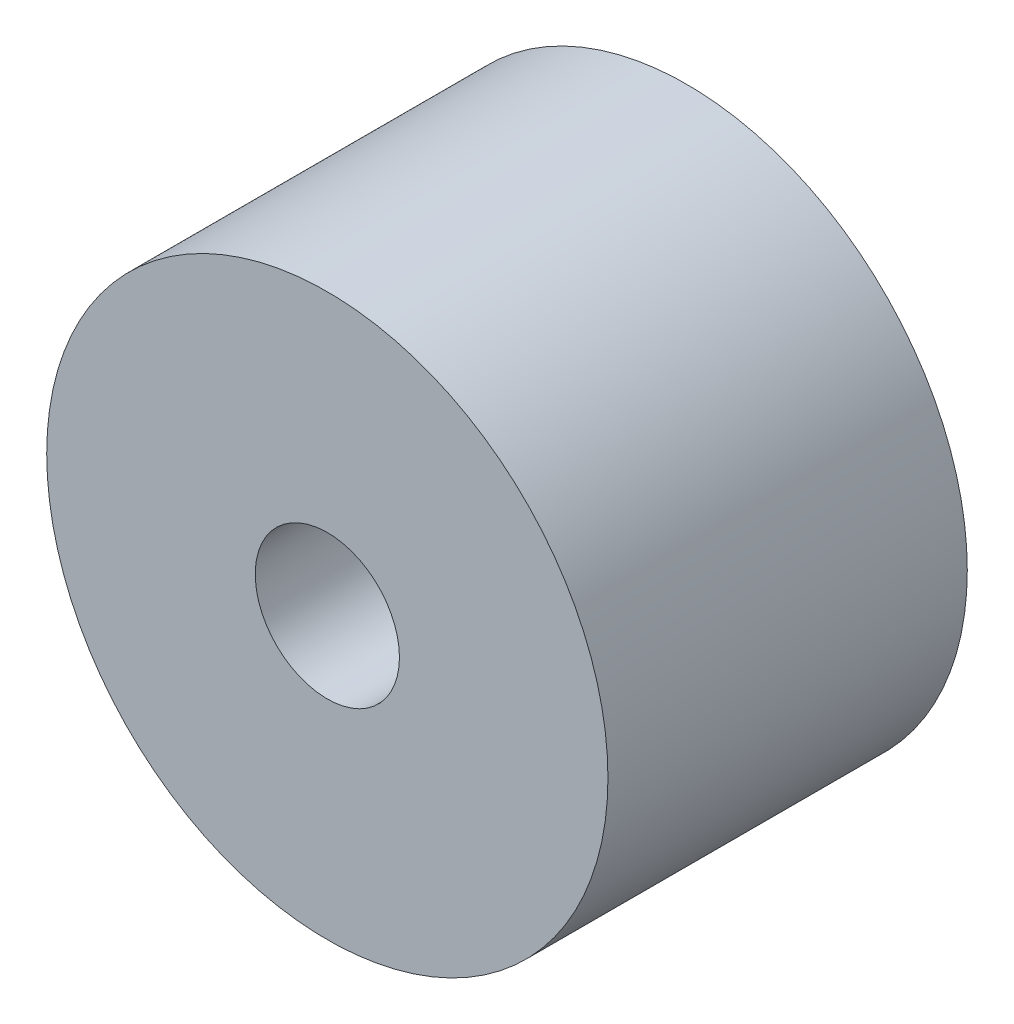
ISO-10303-21;
HEADER;
FILE_DESCRIPTION(('STEP AP214'),'2;1');
FILE_NAME('part.step','',(''),(''),'','','');
FILE_SCHEMA(('AUTOMOTIVE_DESIGN { 1 0 10303 214 1 1 1 1 }'));
ENDSEC;
DATA;
#1=APPLICATION_CONTEXT('core data for automotive mechanical design processes');
#2=APPLICATION_PROTOCOL_DEFINITION('international standard','automotive_design',2000,#1);
#3=PRODUCT_CONTEXT('',#1,'mechanical');
#4=PRODUCT('Part','Part','',(#3));
#5=PRODUCT_RELATED_PRODUCT_CATEGORY('part','',(#4));
#6=PRODUCT_DEFINITION_FORMATION('','',#4);
#7=PRODUCT_DEFINITION_CONTEXT('part definition',#1,'design');
#8=PRODUCT_DEFINITION('design','',#6,#7);
#9=PRODUCT_DEFINITION_SHAPE('','',#8);
#10=(LENGTH_UNIT() NAMED_UNIT(*) SI_UNIT(.MILLI.,.METRE.));
#11=(NAMED_UNIT(*) PLANE_ANGLE_UNIT() SI_UNIT($,.RADIAN.));
#12=(NAMED_UNIT(*) SI_UNIT($,.STERADIAN.) SOLID_ANGLE_UNIT());
#13=UNCERTAINTY_MEASURE_WITH_UNIT(LENGTH_MEASURE(1.E-05),#10,'distance_accuracy_value','');
#14=(GEOMETRIC_REPRESENTATION_CONTEXT(3) GLOBAL_UNCERTAINTY_ASSIGNED_CONTEXT((#13)) GLOBAL_UNIT_ASSIGNED_CONTEXT((#10,
#11,#12)) REPRESENTATION_CONTEXT('',''));
#15=CARTESIAN_POINT('',(0.,0.,0.));
#16=DIRECTION('',(0.,0.,1.));
#17=DIRECTION('',(1.,0.,0.));
#18=AXIS2_PLACEMENT_3D('',#15,#16,#17);
#19=CARTESIAN_POINT('',(0.,0.,2.99));
#20=DIRECTION('',(0.,0.,1.));
#21=DIRECTION('',(1.,0.,0.));
#22=AXIS2_PLACEMENT_3D('',#19,#20,#21);
#23=PLANE('',#22);
#24=CARTESIAN_POINT('',(0.,0.,2.99));
#25=DIRECTION('',(0.,0.,1.));
#26=DIRECTION('',(1.,0.,0.));
#27=AXIS2_PLACEMENT_3D('',#24,#25,#26);
#28=CIRCLE('',#27,2.335);
#29=CARTESIAN_POINT('',(2.335,0.,2.99));
#30=VERTEX_POINT('',#29);
#31=EDGE_CURVE('E10',#30,#30,#28,.T.);
#32=ORIENTED_EDGE('',*,*,#31,.T.);
#33=EDGE_LOOP('',(#32));
#34=FACE_BOUND('',#33,.T.);
#35=CARTESIAN_POINT('',(0.,0.,2.99));
#36=DIRECTION('',(0.,0.,1.));
#37=DIRECTION('',(1.,0.,0.));
#38=AXIS2_PLACEMENT_3D('',#35,#36,#37);
#39=CIRCLE('',#38,0.6);
#40=CARTESIAN_POINT('',(0.6,0.,2.99));
#41=VERTEX_POINT('',#40);
#42=EDGE_CURVE('E43',#41,#41,#39,.T.);
#43=ORIENTED_EDGE('',*,*,#42,.F.);
#44=EDGE_LOOP('',(#43));
#45=FACE_BOUND('',#44,.T.);
#46=ADVANCED_FACE('F32',(#34,#45),#23,.T.);
#47=CARTESIAN_POINT('',(0.,0.,0.));
#48=DIRECTION('',(0.,0.,1.));
#49=DIRECTION('',(1.,0.,0.));
#50=AXIS2_PLACEMENT_3D('',#47,#48,#49);
#51=PLANE('',#50);
#52=CARTESIAN_POINT('',(0.,0.,0.));
#53=DIRECTION('',(0.,0.,1.));
#54=DIRECTION('',(1.,0.,0.));
#55=AXIS2_PLACEMENT_3D('',#52,#53,#54);
#56=CIRCLE('',#55,2.335);
#57=CARTESIAN_POINT('',(2.335,0.,0.));
#58=VERTEX_POINT('',#57);
#59=EDGE_CURVE('E36',#58,#58,#56,.T.);
#60=ORIENTED_EDGE('',*,*,#59,.F.);
#61=EDGE_LOOP('',(#60));
#62=FACE_BOUND('',#61,.T.);
#63=CARTESIAN_POINT('',(0.,0.,0.));
#64=DIRECTION('',(0.,0.,1.));
#65=DIRECTION('',(1.,0.,0.));
#66=AXIS2_PLACEMENT_3D('',#63,#64,#65);
#67=CIRCLE('',#66,0.6);
#68=CARTESIAN_POINT('',(0.6,0.,0.));
#69=VERTEX_POINT('',#68);
#70=EDGE_CURVE('E45',#69,#69,#67,.T.);
#71=ORIENTED_EDGE('',*,*,#70,.T.);
#72=EDGE_LOOP('',(#71));
#73=FACE_BOUND('',#72,.T.);
#74=ADVANCED_FACE('F55',(#62,#73),#51,.F.);
#75=CARTESIAN_POINT('',(0.,0.,2.99));
#76=DIRECTION('',(0.,0.,-1.));
#77=DIRECTION('',(-1.,0.,0.));
#78=AXIS2_PLACEMENT_3D('',#75,#76,#77);
#79=CYLINDRICAL_SURFACE('',#78,2.335);
#80=ORIENTED_EDGE('',*,*,#31,.F.);
#81=EDGE_LOOP('',(#80));
#82=FACE_BOUND('',#81,.T.);
#83=ORIENTED_EDGE('',*,*,#59,.T.);
#84=EDGE_LOOP('',(#83));
#85=FACE_BOUND('',#84,.T.);
#86=ADVANCED_FACE('F34',(#82,#85),#79,.T.);
#87=CARTESIAN_POINT('',(0.,0.,2.99));
#88=DIRECTION('',(0.,0.,-1.));
#89=DIRECTION('',(-1.,0.,0.));
#90=AXIS2_PLACEMENT_3D('',#87,#88,#89);
#91=CYLINDRICAL_SURFACE('',#90,0.6);
#92=ORIENTED_EDGE('',*,*,#42,.T.);
#93=EDGE_LOOP('',(#92));
#94=FACE_BOUND('',#93,.T.);
#95=ORIENTED_EDGE('',*,*,#70,.F.);
#96=EDGE_LOOP('',(#95));
#97=FACE_BOUND('',#96,.T.);
#98=ADVANCED_FACE('F51',(#94,#97),#91,.F.);
#99=CLOSED_SHELL('',(#46,#74,#86,#98));
#100=MANIFOLD_SOLID_BREP('B2',#99);
#101=ADVANCED_BREP_SHAPE_REPRESENTATION('',(#18,#100),#14);
#102=SHAPE_DEFINITION_REPRESENTATION(#9,#101);
ENDSEC;
END-ISO-10303-21;
